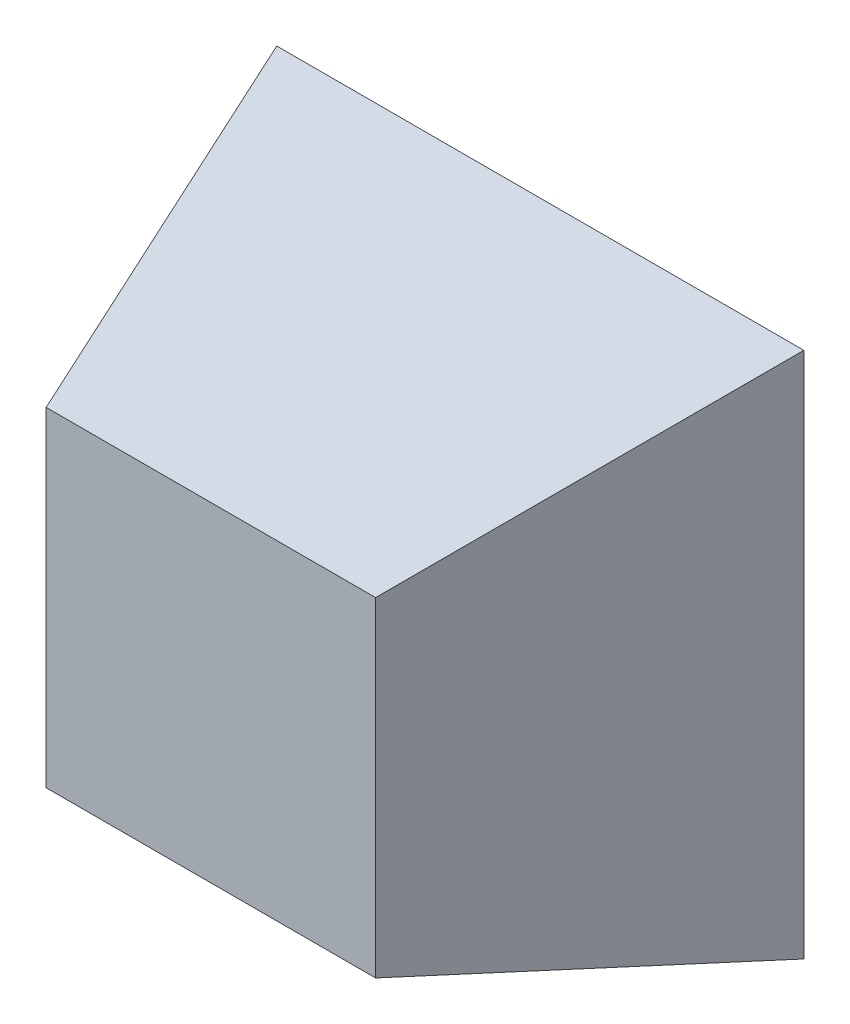
ISO-10303-21;
HEADER;
FILE_DESCRIPTION(('STEP AP214'),'2;1');
FILE_NAME('part.step','',(''),(''),'','','');
FILE_SCHEMA(('AUTOMOTIVE_DESIGN { 1 0 10303 214 1 1 1 1 }'));
ENDSEC;
DATA;
#1=APPLICATION_CONTEXT('core data for automotive mechanical design processes');
#2=APPLICATION_PROTOCOL_DEFINITION('international standard','automotive_design',2000,#1);
#3=PRODUCT_CONTEXT('',#1,'mechanical');
#4=PRODUCT('Part','Part','',(#3));
#5=PRODUCT_RELATED_PRODUCT_CATEGORY('part','',(#4));
#6=PRODUCT_DEFINITION_FORMATION('','',#4);
#7=PRODUCT_DEFINITION_CONTEXT('part definition',#1,'design');
#8=PRODUCT_DEFINITION('design','',#6,#7);
#9=PRODUCT_DEFINITION_SHAPE('','',#8);
#10=(LENGTH_UNIT() NAMED_UNIT(*) SI_UNIT(.MILLI.,.METRE.));
#11=(NAMED_UNIT(*) PLANE_ANGLE_UNIT() SI_UNIT($,.RADIAN.));
#12=(NAMED_UNIT(*) SI_UNIT($,.STERADIAN.) SOLID_ANGLE_UNIT());
#13=UNCERTAINTY_MEASURE_WITH_UNIT(LENGTH_MEASURE(1.E-05),#10,'distance_accuracy_value','');
#14=(GEOMETRIC_REPRESENTATION_CONTEXT(3) GLOBAL_UNCERTAINTY_ASSIGNED_CONTEXT((#13)) GLOBAL_UNIT_ASSIGNED_CONTEXT((#10,
#11,#12)) REPRESENTATION_CONTEXT('',''));
#15=CARTESIAN_POINT('',(0.,0.,0.));
#16=DIRECTION('',(0.,0.,1.));
#17=DIRECTION('',(1.,0.,0.));
#18=AXIS2_PLACEMENT_3D('',#15,#16,#17);
#19=CARTESIAN_POINT('',(0.,0.,50.));
#20=DIRECTION('',(0.,0.,1.));
#21=DIRECTION('',(1.,0.,0.));
#22=AXIS2_PLACEMENT_3D('',#19,#20,#21);
#23=PLANE('',#22);
#24=DIRECTION('',(0.,-1.,0.));
#25=VECTOR('',#24,1.);
#26=CARTESIAN_POINT('',(-25.,40.,50.));
#27=LINE('',#26,#25);
#28=CARTESIAN_POINT('',(-25.,25.,50.));
#29=VERTEX_POINT('',#28);
#30=CARTESIAN_POINT('',(-25.,-25.,50.));
#31=VERTEX_POINT('',#30);
#32=EDGE_CURVE('E58',#29,#31,#27,.T.);
#33=ORIENTED_EDGE('',*,*,#32,.T.);
#34=DIRECTION('',(-1.,0.,0.));
#35=VECTOR('',#34,1.);
#36=CARTESIAN_POINT('',(40.,-25.,50.));
#37=LINE('',#36,#35);
#38=CARTESIAN_POINT('',(25.,-25.,50.));
#39=VERTEX_POINT('',#38);
#40=EDGE_CURVE('E101',#39,#31,#37,.T.);
#41=ORIENTED_EDGE('',*,*,#40,.F.);
#42=DIRECTION('',(0.,-1.,0.));
#43=VECTOR('',#42,1.);
#44=CARTESIAN_POINT('',(25.,40.,50.));
#45=LINE('',#44,#43);
#46=CARTESIAN_POINT('',(25.,25.,50.));
#47=VERTEX_POINT('',#46);
#48=EDGE_CURVE('E110',#47,#39,#45,.T.);
#49=ORIENTED_EDGE('',*,*,#48,.F.);
#50=DIRECTION('',(-1.,0.,0.));
#51=VECTOR('',#50,1.);
#52=CARTESIAN_POINT('',(40.,25.,50.));
#53=LINE('',#52,#51);
#54=EDGE_CURVE('E100',#47,#29,#53,.T.);
#55=ORIENTED_EDGE('',*,*,#54,.T.);
#56=EDGE_LOOP('',(#33,#41,#49,#55));
#57=FACE_BOUND('',#56,.T.);
#58=ADVANCED_FACE('F43',(#57),#23,.T.);
#59=CARTESIAN_POINT('',(0.,0.,0.));
#60=DIRECTION('',(0.,0.,1.));
#61=DIRECTION('',(1.,0.,0.));
#62=AXIS2_PLACEMENT_3D('',#59,#60,#61);
#63=PLANE('',#62);
#64=DIRECTION('',(0.,1.,0.));
#65=VECTOR('',#64,1.);
#66=CARTESIAN_POINT('',(40.,40.,0.));
#67=LINE('',#66,#65);
#68=CARTESIAN_POINT('',(40.,-40.,0.));
#69=VERTEX_POINT('',#68);
#70=CARTESIAN_POINT('',(40.,40.,0.));
#71=VERTEX_POINT('',#70);
#72=EDGE_CURVE('E65',#69,#71,#67,.T.);
#73=ORIENTED_EDGE('',*,*,#72,.F.);
#74=DIRECTION('',(1.,0.,0.));
#75=VECTOR('',#74,1.);
#76=CARTESIAN_POINT('',(-40.,-40.,0.));
#77=LINE('',#76,#75);
#78=CARTESIAN_POINT('',(-40.,-40.,0.));
#79=VERTEX_POINT('',#78);
#80=EDGE_CURVE('E95',#79,#69,#77,.T.);
#81=ORIENTED_EDGE('',*,*,#80,.F.);
#82=DIRECTION('',(0.,-1.,0.));
#83=VECTOR('',#82,1.);
#84=CARTESIAN_POINT('',(-40.,40.,0.));
#85=LINE('',#84,#83);
#86=CARTESIAN_POINT('',(-40.,40.,0.));
#87=VERTEX_POINT('',#86);
#88=EDGE_CURVE('E83',#87,#79,#85,.T.);
#89=ORIENTED_EDGE('',*,*,#88,.F.);
#90=DIRECTION('',(-1.,0.,0.));
#91=VECTOR('',#90,1.);
#92=CARTESIAN_POINT('',(-40.,40.,0.));
#93=LINE('',#92,#91);
#94=EDGE_CURVE('E89',#71,#87,#93,.T.);
#95=ORIENTED_EDGE('',*,*,#94,.F.);
#96=EDGE_LOOP('',(#73,#81,#89,#95));
#97=FACE_BOUND('',#96,.T.);
#98=ADVANCED_FACE('F45',(#97),#63,.F.);
#99=CARTESIAN_POINT('',(40.,-25.,50.));
#100=DIRECTION('',(0.,0.957826285221152,-0.287347885566345));
#101=DIRECTION('',(0.,0.287347885566345,0.957826285221152));
#102=AXIS2_PLACEMENT_3D('',#99,#100,#101);
#103=PLANE('',#102);
#104=ORIENTED_EDGE('',*,*,#40,.T.);
#105=DIRECTION('',(-0.276172385369497,-0.276172385369497,-0.920574617898323));
#106=VECTOR('',#105,1.);
#107=CARTESIAN_POINT('',(-20.0423728813559,-20.0423728813559,66.5254237288136));
#108=LINE('',#107,#106);
#109=EDGE_CURVE('E104',#31,#79,#108,.T.);
#110=ORIENTED_EDGE('',*,*,#109,.T.);
#111=ORIENTED_EDGE('',*,*,#80,.T.);
#112=DIRECTION('',(-0.276172385369497,0.276172385369497,0.920574617898324));
#113=VECTOR('',#112,1.);
#114=CARTESIAN_POINT('',(26.1440677966102,-26.1440677966102,46.1864406779661));
#115=LINE('',#114,#113);
#116=EDGE_CURVE('E107',#69,#39,#115,.T.);
#117=ORIENTED_EDGE('',*,*,#116,.T.);
#118=EDGE_LOOP('',(#104,#110,#111,#117));
#119=FACE_BOUND('',#118,.T.);
#120=ADVANCED_FACE('F116',(#119),#103,.F.);
#121=CARTESIAN_POINT('',(40.,25.,50.));
#122=DIRECTION('',(0.,-0.957826285221151,-0.287347885566346));
#123=DIRECTION('',(0.,0.287347885566346,-0.957826285221151));
#124=AXIS2_PLACEMENT_3D('',#121,#122,#123);
#125=PLANE('',#124);
#126=ORIENTED_EDGE('',*,*,#94,.T.);
#127=DIRECTION('',(0.276172385369497,-0.276172385369497,0.920574617898323));
#128=VECTOR('',#127,1.);
#129=CARTESIAN_POINT('',(-20.0423728813559,20.0423728813559,66.5254237288136));
#130=LINE('',#129,#128);
#131=EDGE_CURVE('E11',#87,#29,#130,.T.);
#132=ORIENTED_EDGE('',*,*,#131,.T.);
#133=ORIENTED_EDGE('',*,*,#54,.F.);
#134=DIRECTION('',(0.276172385369497,0.276172385369498,-0.920574617898323));
#135=VECTOR('',#134,1.);
#136=CARTESIAN_POINT('',(26.1440677966102,26.1440677966102,46.1864406779661));
#137=LINE('',#136,#135);
#138=EDGE_CURVE('E51',#47,#71,#137,.T.);
#139=ORIENTED_EDGE('',*,*,#138,.T.);
#140=EDGE_LOOP('',(#126,#132,#133,#139));
#141=FACE_BOUND('',#140,.T.);
#142=ADVANCED_FACE('F90',(#141),#125,.F.);
#143=CARTESIAN_POINT('',(40.,40.,0.));
#144=DIRECTION('',(-0.957826285221151,0.,-0.287347885566345));
#145=DIRECTION('',(-0.287347885566345,0.,0.957826285221151));
#146=AXIS2_PLACEMENT_3D('',#143,#144,#145);
#147=PLANE('',#146);
#148=ORIENTED_EDGE('',*,*,#72,.T.);
#149=ORIENTED_EDGE('',*,*,#138,.F.);
#150=ORIENTED_EDGE('',*,*,#48,.T.);
#151=ORIENTED_EDGE('',*,*,#116,.F.);
#152=EDGE_LOOP('',(#148,#149,#150,#151));
#153=FACE_BOUND('',#152,.T.);
#154=ADVANCED_FACE('F117',(#153),#147,.F.);
#155=CARTESIAN_POINT('',(-25.,40.,50.));
#156=DIRECTION('',(0.957826285221151,0.,-0.287347885566346));
#157=DIRECTION('',(-0.287347885566346,0.,-0.957826285221151));
#158=AXIS2_PLACEMENT_3D('',#155,#156,#157);
#159=PLANE('',#158);
#160=ORIENTED_EDGE('',*,*,#32,.F.);
#161=ORIENTED_EDGE('',*,*,#131,.F.);
#162=ORIENTED_EDGE('',*,*,#88,.T.);
#163=ORIENTED_EDGE('',*,*,#109,.F.);
#164=EDGE_LOOP('',(#160,#161,#162,#163));
#165=FACE_BOUND('',#164,.T.);
#166=ADVANCED_FACE('F81',(#165),#159,.F.);
#167=CLOSED_SHELL('',(#58,#98,#120,#142,#154,#166));
#168=MANIFOLD_SOLID_BREP('B2',#167);
#169=ADVANCED_BREP_SHAPE_REPRESENTATION('',(#18,#168),#14);
#170=SHAPE_DEFINITION_REPRESENTATION(#9,#169);
ENDSEC;
END-ISO-10303-21;
